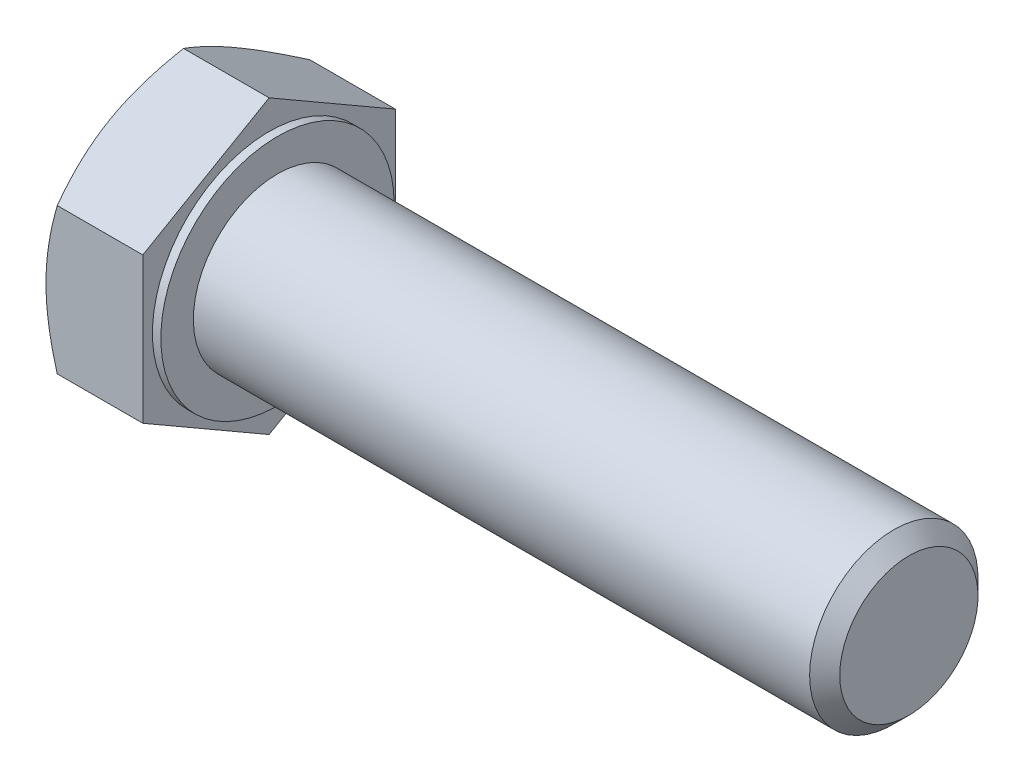
ISO-10303-21;
HEADER;
FILE_DESCRIPTION(('STEP AP214'),'2;1');
FILE_NAME('part.step','',(''),(''),'','','');
FILE_SCHEMA(('AUTOMOTIVE_DESIGN { 1 0 10303 214 1 1 1 1 }'));
ENDSEC;
DATA;
#1=APPLICATION_CONTEXT('core data for automotive mechanical design processes');
#2=APPLICATION_PROTOCOL_DEFINITION('international standard','automotive_design',2000,#1);
#3=PRODUCT_CONTEXT('',#1,'mechanical');
#4=PRODUCT('Part','Part','',(#3));
#5=PRODUCT_RELATED_PRODUCT_CATEGORY('part','',(#4));
#6=PRODUCT_DEFINITION_FORMATION('','',#4);
#7=PRODUCT_DEFINITION_CONTEXT('part definition',#1,'design');
#8=PRODUCT_DEFINITION('design','',#6,#7);
#9=PRODUCT_DEFINITION_SHAPE('','',#8);
#10=(LENGTH_UNIT() NAMED_UNIT(*) SI_UNIT(.MILLI.,.METRE.));
#11=(NAMED_UNIT(*) PLANE_ANGLE_UNIT() SI_UNIT($,.RADIAN.));
#12=(NAMED_UNIT(*) SI_UNIT($,.STERADIAN.) SOLID_ANGLE_UNIT());
#13=UNCERTAINTY_MEASURE_WITH_UNIT(LENGTH_MEASURE(1.E-05),#10,'distance_accuracy_value','');
#14=(GEOMETRIC_REPRESENTATION_CONTEXT(3) GLOBAL_UNCERTAINTY_ASSIGNED_CONTEXT((#13)) GLOBAL_UNIT_ASSIGNED_CONTEXT((#10,
#11,#12)) REPRESENTATION_CONTEXT('',''));
#15=CARTESIAN_POINT('',(0.,0.,0.));
#16=DIRECTION('',(0.,0.,1.));
#17=DIRECTION('',(1.,0.,0.));
#18=AXIS2_PLACEMENT_3D('',#15,#16,#17);
#19=CARTESIAN_POINT('',(45.,3.00000000000001,0.));
#20=DIRECTION('',(1.,0.,0.));
#21=DIRECTION('',(0.,0.,-1.));
#22=AXIS2_PLACEMENT_3D('',#19,#20,#21);
#23=PLANE('',#22);
#24=CARTESIAN_POINT('',(45.0000000071909,0.,0.));
#25=DIRECTION('',(-1.,0.,0.));
#26=DIRECTION('',(0.,0.,1.));
#27=AXIS2_PLACEMENT_3D('',#24,#25,#26);
#28=CIRCLE('',#27,4.92646250719158);
#29=CARTESIAN_POINT('',(45.0000000071909,0.,4.92646250719158));
#30=VERTEX_POINT('',#29);
#31=EDGE_CURVE('E20',#30,#30,#28,.T.);
#32=ORIENTED_EDGE('',*,*,#31,.F.);
#33=EDGE_LOOP('',(#32));
#34=FACE_BOUND('',#33,.T.);
#35=ADVANCED_FACE('F17',(#34),#23,.T.);
#36=CARTESIAN_POINT('',(-7.50009999999999,0.,0.));
#37=DIRECTION('',(-1.,0.,0.));
#38=DIRECTION('',(0.,0.,1.));
#39=AXIS2_PLACEMENT_3D('',#36,#37,#38);
#40=PLANE('',#39);
#41=CARTESIAN_POINT('',(-7.50010001243555,0.,0.));
#42=DIRECTION('',(1.,0.,0.));
#43=DIRECTION('',(0.,0.,-1.));
#44=AXIS2_PLACEMENT_3D('',#41,#42,#43);
#45=CIRCLE('',#44,9.0000000071797);
#46=CARTESIAN_POINT('',(-7.50010001450815,-7.79422863716885,4.50000000179492));
#47=VERTEX_POINT('',#46);
#48=CARTESIAN_POINT('',(-7.50010001450814,-7.79422863716886,-4.50000000179494));
#49=VERTEX_POINT('',#48);
#50=EDGE_CURVE('E93',#47,#49,#45,.T.);
#51=ORIENTED_EDGE('',*,*,#50,.F.);
#52=CARTESIAN_POINT('',(-7.50010001243554,0.,0.));
#53=DIRECTION('',(1.,0.,0.));
#54=DIRECTION('',(0.,0.,-1.));
#55=AXIS2_PLACEMENT_3D('',#52,#53,#54);
#56=CIRCLE('',#55,9.0000000071797);
#57=CARTESIAN_POINT('',(-7.50010001450815,0.,9.00000000358985));
#58=VERTEX_POINT('',#57);
#59=EDGE_CURVE('E89',#58,#47,#56,.T.);
#60=ORIENTED_EDGE('',*,*,#59,.F.);
#61=CARTESIAN_POINT('',(-7.50010001243554,0.,0.));
#62=DIRECTION('',(1.,0.,0.));
#63=DIRECTION('',(0.,0.,-1.));
#64=AXIS2_PLACEMENT_3D('',#61,#62,#63);
#65=CIRCLE('',#64,9.0000000071797);
#66=CARTESIAN_POINT('',(-7.50010001450814,7.79422863716886,4.50000000179494));
#67=VERTEX_POINT('',#66);
#68=EDGE_CURVE('E86',#67,#58,#65,.T.);
#69=ORIENTED_EDGE('',*,*,#68,.F.);
#70=CARTESIAN_POINT('',(-7.50010001243555,0.,0.));
#71=DIRECTION('',(1.,0.,0.));
#72=DIRECTION('',(0.,0.,-1.));
#73=AXIS2_PLACEMENT_3D('',#70,#71,#72);
#74=CIRCLE('',#73,9.0000000071797);
#75=CARTESIAN_POINT('',(-7.50010001450815,7.79422863716885,-4.50000000179492));
#76=VERTEX_POINT('',#75);
#77=EDGE_CURVE('E165',#76,#67,#74,.T.);
#78=ORIENTED_EDGE('',*,*,#77,.F.);
#79=CARTESIAN_POINT('',(-7.50010001243555,0.,0.));
#80=DIRECTION('',(1.,0.,0.));
#81=DIRECTION('',(0.,0.,-1.));
#82=AXIS2_PLACEMENT_3D('',#79,#80,#81);
#83=CIRCLE('',#82,9.0000000071797);
#84=CARTESIAN_POINT('',(-7.50010001450815,0.,-9.00000000358984));
#85=VERTEX_POINT('',#84);
#86=EDGE_CURVE('E456',#85,#76,#83,.T.);
#87=ORIENTED_EDGE('',*,*,#86,.F.);
#88=CARTESIAN_POINT('',(-7.50010001243554,0.,0.));
#89=DIRECTION('',(1.,0.,0.));
#90=DIRECTION('',(0.,0.,-1.));
#91=AXIS2_PLACEMENT_3D('',#88,#89,#90);
#92=CIRCLE('',#91,9.0000000071797);
#93=EDGE_CURVE('E453',#49,#85,#92,.T.);
#94=ORIENTED_EDGE('',*,*,#93,.F.);
#95=EDGE_LOOP('',(#51,#60,#69,#78,#87,#94));
#96=FACE_BOUND('',#95,.T.);
#97=ADVANCED_FACE('F91',(#96),#40,.T.);
#98=CARTESIAN_POINT('',(45.0000000071909,0.,0.));
#99=DIRECTION('',(-1.,0.,0.));
#100=DIRECTION('',(0.,0.,1.));
#101=AXIS2_PLACEMENT_3D('',#98,#99,#100);
#102=CONICAL_SURFACE('',#101,4.92646250719158,0.785351577178396);
#103=CARTESIAN_POINT('',(43.9263625,0.,0.));
#104=DIRECTION('',(1.,0.,0.));
#105=DIRECTION('',(0.,1.,0.));
#106=AXIS2_PLACEMENT_3D('',#103,#104,#105);
#107=CIRCLE('',#106,6.);
#108=CARTESIAN_POINT('',(43.9263625,6.,0.));
#109=VERTEX_POINT('',#108);
#110=EDGE_CURVE('E164',#109,#109,#107,.F.);
#111=ORIENTED_EDGE('',*,*,#110,.F.);
#112=EDGE_LOOP('',(#111));
#113=FACE_BOUND('',#112,.T.);
#114=ORIENTED_EDGE('',*,*,#31,.T.);
#115=EDGE_LOOP('',(#114));
#116=FACE_BOUND('',#115,.T.);
#117=ADVANCED_FACE('F249',(#113,#116),#102,.T.);
#118=CARTESIAN_POINT('',(-7.50010001243556,0.,0.));
#119=DIRECTION('',(1.,0.,0.));
#120=DIRECTION('',(0.,0.,-1.));
#121=AXIS2_PLACEMENT_3D('',#118,#119,#120);
#122=CONICAL_SURFACE('',#121,9.00000000717967,1.04719753333333);
#123=ORIENTED_EDGE('',*,*,#68,.T.);
#124=CARTESIAN_POINT('',(-6.69625240925319,5.19615241882295,9.00000000306425));
#125=CARTESIAN_POINT('',(-6.81838240506194,4.77318782642183,9.00000000107036));
#126=CARTESIAN_POINT('',(-6.93027480435703,4.34683598151208,9.00000000027976));
#127=CARTESIAN_POINT('',(-7.12759503650367,3.49037404218685,8.99999999972165));
#128=CARTESIAN_POINT('',(-7.21315373088933,3.06029382193967,8.99999999994899));
#129=CARTESIAN_POINT('',(-7.31820528155209,2.41111457768678,9.00000000002554));
#130=CARTESIAN_POINT('',(-7.34935413580915,2.193901443881,9.00000000000688));
#131=CARTESIAN_POINT('',(-7.40327345186691,1.75843528837459,8.99999999999313));
#132=CARTESIAN_POINT('',(-7.4260441341874,1.54018229419705,8.99999999999803));
#133=CARTESIAN_POINT('',(-7.462807025849,1.10182912707807,9.00000000000198));
#134=CARTESIAN_POINT('',(-7.47675459291258,0.881725181381577,9.00000000000099));
#135=CARTESIAN_POINT('',(-7.49542039352945,0.44108441678106,8.99999999999901));
#136=CARTESIAN_POINT('',(-7.50013679924242,0.220547520801381,8.99999999999802));
#137=CARTESIAN_POINT('',(-7.50010001658075,2.99145516754869E-10,9.));
#138=B_SPLINE_CURVE_WITH_KNOTS('',3,(#124,#125,#126,#127,#128,#129,#130,#131,#132,#133,#134,
#135,#136,#137),.UNSPECIFIED.,.F.,.F.,(4,2,2,2,2,2,4),(0.,1.32126598561536,2.63585597891325,
3.29401348411379,3.95215366487481,4.61359774681925,5.27517278649075),.UNSPECIFIED.);
#139=CARTESIAN_POINT('',(-6.69625240740134,5.19615242160208,8.99999999808684));
#140=VERTEX_POINT('',#139);
#141=EDGE_CURVE('E112',#140,#58,#138,.T.);
#142=ORIENTED_EDGE('',*,*,#141,.F.);
#143=CARTESIAN_POINT('',(-7.50010001554443,7.79422863250553,4.49999999910256));
#144=CARTESIAN_POINT('',(-7.50013679887546,7.68395487321934,4.69099975522869));
#145=CARTESIAN_POINT('',(-7.49542039343614,7.57368642561111,4.88199030990155));
#146=CARTESIAN_POINT('',(-7.47675459301751,7.35336604356536,5.2635964062384));
#147=CARTESIAN_POINT('',(-7.46280702587908,7.24331407059011,5.45421201465193));
#148=CARTESIAN_POINT('',(-7.42604413416269,7.02413748692393,5.83383699320663));
#149=CARTESIAN_POINT('',(-7.40327345186256,6.91501098985476,6.02284963064916));
#150=CARTESIAN_POINT('',(-7.34935413580532,6.69727791210452,6.39997438385152));
#151=CARTESIAN_POINT('',(-7.31820528152822,6.58867134518502,6.58808647577563));
#152=CARTESIAN_POINT('',(-7.21315373088869,6.26408172300407,7.15029219297503));
#153=CARTESIAN_POINT('',(-7.12759503663,6.04904161284127,7.52275258945137));
#154=CARTESIAN_POINT('',(-6.93027480410838,5.62081064316584,8.26447038632218));
#155=CARTESIAN_POINT('',(-6.81838240430633,5.40763472073798,8.6337019149269));
#156=CARTESIAN_POINT('',(-6.69625240724701,5.1961524246485,8.99999999663664));
#157=B_SPLINE_CURVE_WITH_KNOTS('',3,(#143,#144,#145,#146,#147,#148,#149,#150,#151,#152,#153,
#154,#155,#156),.UNSPECIFIED.,.F.,.F.,(4,2,2,2,2,2,4),(0.,0.66157503981644,1.32301912187116,
1.98115930268459,2.63931680795318,3.95390680140696,5.27517278727339),.UNSPECIFIED.);
#158=EDGE_CURVE('E106',#67,#140,#157,.T.);
#159=ORIENTED_EDGE('',*,*,#158,.F.);
#160=EDGE_LOOP('',(#123,#142,#159));
#161=FACE_BOUND('',#160,.T.);
#162=ADVANCED_FACE('F111',(#161),#122,.T.);
#163=CARTESIAN_POINT('',(-7.50010001243557,0.,0.));
#164=DIRECTION('',(1.,0.,0.));
#165=DIRECTION('',(0.,0.,-1.));
#166=AXIS2_PLACEMENT_3D('',#163,#164,#165);
#167=CONICAL_SURFACE('',#166,9.00000000717966,1.04719753333333);
#168=CARTESIAN_POINT('',(-7.50010001554445,0.,8.99999999820509));
#169=CARTESIAN_POINT('',(-7.50013679887548,-0.220547520564954,8.9999999993555));
#170=CARTESIAN_POINT('',(-7.49542039343615,-0.441084416598651,8.99999999982733));
#171=CARTESIAN_POINT('',(-7.47675459301752,-0.881725181288248,9.00000000017264));
#172=CARTESIAN_POINT('',(-7.4628070258791,-1.10182912701982,9.00000000004624));
#173=CARTESIAN_POINT('',(-7.4260441341627,-1.54018229419241,8.99999999995399));
#174=CARTESIAN_POINT('',(-7.40327345186258,-1.75843528838851,8.99999999998735));
#175=CARTESIAN_POINT('',(-7.34935413580534,-2.19390144393281,9.00000000001265));
#176=CARTESIAN_POINT('',(-7.31820528152824,-2.41111457775788,9.0000000000046));
#177=CARTESIAN_POINT('',(-7.21315373088871,-3.06029382209588,8.99999999999081));
#178=CARTESIAN_POINT('',(-7.12759503663001,-3.49037404242943,8.9999999999954));
#179=CARTESIAN_POINT('',(-6.93027480410839,-4.34683598179628,9.00000000000463));
#180=CARTESIAN_POINT('',(-6.81838240430634,-4.77318782666006,9.00000000000928));
#181=CARTESIAN_POINT('',(-6.69625240724702,-5.19615241882294,9.));
#182=B_SPLINE_CURVE_WITH_KNOTS('',3,(#168,#169,#170,#171,#172,#173,#174,#175,#176,#177,#178,
#179,#180,#181),.UNSPECIFIED.,.F.,.F.,(4,2,2,2,2,2,4),(0.,0.661575039816441,1.32301912187116,
1.98115930268459,2.63931680795319,3.95390680140696,5.2751727872734),.UNSPECIFIED.);
#183=CARTESIAN_POINT('',(-6.69625240740134,-5.19615242160206,8.99999999808683));
#184=VERTEX_POINT('',#183);
#185=EDGE_CURVE('E99',#58,#184,#182,.T.);
#186=ORIENTED_EDGE('',*,*,#185,.F.);
#187=ORIENTED_EDGE('',*,*,#59,.T.);
#188=CARTESIAN_POINT('',(-6.69625240925319,-5.19615242730219,8.99999999816875));
#189=CARTESIAN_POINT('',(-6.81838240506194,-5.40763472177598,8.63370191525111));
#190=CARTESIAN_POINT('',(-6.93027480435704,-5.62081064354618,8.2644703862136));
#191=CARTESIAN_POINT('',(-7.12759503650368,-6.04904161272546,7.52275258910441));
#192=CARTESIAN_POINT('',(-7.21315373088933,-6.26408172304593,7.15029219281882));
#193=CARTESIAN_POINT('',(-7.3182052815521,-6.58867134523867,6.5880864757245));
#194=CARTESIAN_POINT('',(-7.34935413580915,-6.6972779121254,6.39997438380374));
#195=CARTESIAN_POINT('',(-7.40327345186692,-6.91501098986669,6.02284963063997));
#196=CARTESIAN_POINT('',(-7.42604413418741,-7.02413748695971,5.83383699323266));
#197=CARTESIAN_POINT('',(-7.46280702584901,-7.24331407052262,5.45421201468022));
#198=CARTESIAN_POINT('',(-7.47675459291258,-7.35336604337001,5.26359640623338));
#199=CARTESIAN_POINT('',(-7.49542039352946,-7.57368642566855,4.88199031014534));
#200=CARTESIAN_POINT('',(-7.50013679924243,-7.68395487365753,4.69099975575468));
#201=CARTESIAN_POINT('',(-7.50010001658075,-7.79422863391037,4.50000000025906));
#202=B_SPLINE_CURVE_WITH_KNOTS('',3,(#188,#189,#190,#191,#192,#193,#194,#195,#196,#197,#198,
#199,#200,#201),.UNSPECIFIED.,.F.,.F.,(4,2,2,2,2,2,4),(0.,1.32126598561536,2.63585597891324,
3.29401348411379,3.95215366487481,4.61359774681925,5.27517278649075),.UNSPECIFIED.);
#203=EDGE_CURVE('E101',#184,#47,#202,.T.);
#204=ORIENTED_EDGE('',*,*,#203,.F.);
#205=EDGE_LOOP('',(#186,#187,#204));
#206=FACE_BOUND('',#205,.T.);
#207=ADVANCED_FACE('F100',(#206),#167,.T.);
#208=CARTESIAN_POINT('',(-7.50010001243557,0.,0.));
#209=DIRECTION('',(1.,0.,0.));
#210=DIRECTION('',(0.,0.,-1.));
#211=AXIS2_PLACEMENT_3D('',#208,#209,#210);
#212=CONICAL_SURFACE('',#211,9.00000000717966,1.04719753333333);
#213=CARTESIAN_POINT('',(-7.50010001554446,-7.79422863250551,4.49999999910254));
#214=CARTESIAN_POINT('',(-7.50013679887549,-7.90450239378426,4.30900024412682));
#215=CARTESIAN_POINT('',(-7.49542039343616,-8.01477084220973,4.11800968992579));
#216=CARTESIAN_POINT('',(-7.47675459301753,-8.23509122485357,3.73640359393425));
#217=CARTESIAN_POINT('',(-7.46280702587911,-8.34514319760989,3.54578798539431));
#218=CARTESIAN_POINT('',(-7.42604413416271,-8.5643197811163,3.16616300674736));
#219=CARTESIAN_POINT('',(-7.40327345186259,-8.67344627824324,2.97715036933819));
#220=CARTESIAN_POINT('',(-7.34935413580535,-8.8911793560373,2.60002561616114));
#221=CARTESIAN_POINT('',(-7.31820528152825,-8.99978592294287,2.41191352422897));
#222=CARTESIAN_POINT('',(-7.21315373088871,-9.32437554509992,1.84970780701578));
#223=CARTESIAN_POINT('',(-7.12759503663002,-9.53941565527067,1.47724741054401));
#224=CARTESIAN_POINT('',(-6.9302748041084,-9.96764662496209,0.735529613682441));
#225=CARTESIAN_POINT('',(-6.81838240430635,-10.180822547398,0.366298085082375));
#226=CARTESIAN_POINT('',(-6.69625240724703,-10.3923048434714,3.36335147473121E-09));
#227=B_SPLINE_CURVE_WITH_KNOTS('',3,(#213,#214,#215,#216,#217,#218,#219,#220,#221,#222,#223,
#224,#225,#226),.UNSPECIFIED.,.F.,.F.,(4,2,2,2,2,2,4),(0.,0.661575039816443,1.32301912187116,
1.9811593026846,2.6393168079532,3.95390680140698,5.27517278727341),.UNSPECIFIED.);
#228=CARTESIAN_POINT('',(-6.69625240740134,-10.3923048432041,0.));
#229=VERTEX_POINT('',#228);
#230=EDGE_CURVE('E117',#47,#229,#227,.T.);
#231=ORIENTED_EDGE('',*,*,#230,.F.);
#232=ORIENTED_EDGE('',*,*,#50,.T.);
#233=CARTESIAN_POINT('',(-6.69625240925317,-10.3923048461251,-4.89552124357249E-09));
#234=CARTESIAN_POINT('',(-6.81838240506192,-10.1808225481978,-0.366298085819271));
#235=CARTESIAN_POINT('',(-6.93027480435702,-9.96764662505829,-0.735529614066183));
#236=CARTESIAN_POINT('',(-7.12759503650366,-9.53941565491234,-1.47724741061726));
#237=CARTESIAN_POINT('',(-7.21315373088931,-9.32437554498563,-1.84970780713019));
#238=CARTESIAN_POINT('',(-7.31820528155207,-8.99978592292548,-2.41191352430106));
#239=CARTESIAN_POINT('',(-7.34935413580913,-8.89117935600643,-2.60002561620315));
#240=CARTESIAN_POINT('',(-7.40327345186689,-8.67344627824131,-2.97715036935317));
#241=CARTESIAN_POINT('',(-7.42604413418738,-8.56431978115679,-3.16616300676539));
#242=CARTESIAN_POINT('',(-7.46280702584899,-8.34514319760072,-3.54578798532177));
#243=CARTESIAN_POINT('',(-7.47675459291256,-8.23509122475162,-3.73640359376762));
#244=CARTESIAN_POINT('',(-7.49542039352944,-8.01477084244965,-4.11800968985368));
#245=CARTESIAN_POINT('',(-7.50013679924241,-7.90450239445895,-4.30900024424335));
#246=CARTESIAN_POINT('',(-7.50010001658073,-7.79422863420955,-4.49999999974095));
#247=B_SPLINE_CURVE_WITH_KNOTS('',3,(#233,#234,#235,#236,#237,#238,#239,#240,#241,#242,#243,
#244,#245,#246),.UNSPECIFIED.,.F.,.F.,(4,2,2,2,2,2,4),(0.,1.32126598561536,2.63585597891324,
3.29401348411378,3.9521536648748,4.61359774681923,5.27517278649074),.UNSPECIFIED.);
#248=EDGE_CURVE('E219',#229,#49,#247,.T.);
#249=ORIENTED_EDGE('',*,*,#248,.F.);
#250=EDGE_LOOP('',(#231,#232,#249));
#251=FACE_BOUND('',#250,.T.);
#252=ADVANCED_FACE('F227',(#251),#212,.T.);
#253=CARTESIAN_POINT('',(-7.50010001243556,0.,0.));
#254=DIRECTION('',(1.,0.,0.));
#255=DIRECTION('',(0.,0.,-1.));
#256=AXIS2_PLACEMENT_3D('',#253,#254,#255);
#257=CONICAL_SURFACE('',#256,9.00000000717967,1.04719753333333);
#258=CARTESIAN_POINT('',(-7.50010001554443,-7.79422863250553,-4.49999999910256));
#259=CARTESIAN_POINT('',(-7.50013679887546,-7.68395487321934,-4.69099975522868));
#260=CARTESIAN_POINT('',(-7.49542039343614,-7.57368642561111,-4.88199030990155));
#261=CARTESIAN_POINT('',(-7.47675459301751,-7.35336604356536,-5.2635964062384));
#262=CARTESIAN_POINT('',(-7.46280702587909,-7.24331407059011,-5.45421201465193));
#263=CARTESIAN_POINT('',(-7.42604413416269,-7.02413748692393,-5.83383699320663));
#264=CARTESIAN_POINT('',(-7.40327345186257,-6.91501098985476,-6.02284963064916));
#265=CARTESIAN_POINT('',(-7.34935413580533,-6.69727791210452,-6.39997438385151));
#266=CARTESIAN_POINT('',(-7.31820528152823,-6.58867134518502,-6.58808647577563));
#267=CARTESIAN_POINT('',(-7.2131537308887,-6.26408172300407,-7.15029219297502));
#268=CARTESIAN_POINT('',(-7.12759503663,-6.04904161284127,-7.52275258945137));
#269=CARTESIAN_POINT('',(-6.93027480410838,-5.62081064316584,-8.26447038632218));
#270=CARTESIAN_POINT('',(-6.81838240430633,-5.40763472073798,-8.63370191492689));
#271=CARTESIAN_POINT('',(-6.69625240724701,-5.1961524246485,-8.99999999663663));
#272=B_SPLINE_CURVE_WITH_KNOTS('',3,(#258,#259,#260,#261,#262,#263,#264,#265,#266,#267,#268,
#269,#270,#271),.UNSPECIFIED.,.F.,.F.,(4,2,2,2,2,2,4),(0.,0.66157503981644,1.32301912187116,
1.98115930268459,2.63931680795318,3.95390680140696,5.27517278727339),.UNSPECIFIED.);
#273=CARTESIAN_POINT('',(-6.69625240740134,-5.19615242160208,-8.99999999808683));
#274=VERTEX_POINT('',#273);
#275=EDGE_CURVE('E231',#49,#274,#272,.T.);
#276=ORIENTED_EDGE('',*,*,#275,.F.);
#277=ORIENTED_EDGE('',*,*,#93,.T.);
#278=CARTESIAN_POINT('',(-6.69625240925319,-5.19615241882295,-9.00000000306424));
#279=CARTESIAN_POINT('',(-6.81838240506194,-4.77318782642184,-9.00000000107035));
#280=CARTESIAN_POINT('',(-6.93027480435704,-4.34683598151208,-9.00000000027975));
#281=CARTESIAN_POINT('',(-7.12759503650368,-3.49037404218686,-8.99999999972164));
#282=CARTESIAN_POINT('',(-7.21315373088933,-3.06029382193968,-8.99999999994898));
#283=CARTESIAN_POINT('',(-7.3182052815521,-2.41111457768678,-9.00000000002553));
#284=CARTESIAN_POINT('',(-7.34935413580915,-2.19390144388101,-9.00000000000687));
#285=CARTESIAN_POINT('',(-7.40327345186692,-1.7584352883746,-8.99999999999312));
#286=CARTESIAN_POINT('',(-7.4260441341874,-1.54018229419706,-8.99999999999802));
#287=CARTESIAN_POINT('',(-7.46280702584901,-1.10182912707807,-9.00000000000197));
#288=CARTESIAN_POINT('',(-7.47675459291258,-0.881725181381582,-9.00000000000098));
#289=CARTESIAN_POINT('',(-7.49542039352946,-0.441084416781066,-8.999999999999));
#290=CARTESIAN_POINT('',(-7.50013679924243,-0.220547520801387,-8.99999999999801));
#291=CARTESIAN_POINT('',(-7.50010001658075,-2.99151264265217E-10,-8.99999999999999));
#292=B_SPLINE_CURVE_WITH_KNOTS('',3,(#278,#279,#280,#281,#282,#283,#284,#285,#286,#287,#288,
#289,#290,#291),.UNSPECIFIED.,.F.,.F.,(4,2,2,2,2,2,4),(0.,1.32126598561536,2.63585597891324,
3.29401348411379,3.95215366487481,4.61359774681925,5.27517278649075),.UNSPECIFIED.);
#293=EDGE_CURVE('E213',#274,#85,#292,.T.);
#294=ORIENTED_EDGE('',*,*,#293,.F.);
#295=EDGE_LOOP('',(#276,#277,#294));
#296=FACE_BOUND('',#295,.T.);
#297=ADVANCED_FACE('F224',(#296),#257,.T.);
#298=CARTESIAN_POINT('',(-7.50010001243557,0.,0.));
#299=DIRECTION('',(1.,0.,0.));
#300=DIRECTION('',(0.,0.,-1.));
#301=AXIS2_PLACEMENT_3D('',#298,#299,#300);
#302=CONICAL_SURFACE('',#301,9.00000000717966,1.04719753333333);
#303=ORIENTED_EDGE('',*,*,#86,.T.);
#304=CARTESIAN_POINT('',(-6.69625240925319,5.19615242730219,-8.99999999816874));
#305=CARTESIAN_POINT('',(-6.81838240506194,5.40763472177598,-8.63370191525111));
#306=CARTESIAN_POINT('',(-6.93027480435704,5.62081064354618,-8.2644703862136));
#307=CARTESIAN_POINT('',(-7.12759503650368,6.04904161272546,-7.52275258910441));
#308=CARTESIAN_POINT('',(-7.21315373088933,6.26408172304593,-7.15029219281882));
#309=CARTESIAN_POINT('',(-7.3182052815521,6.58867134523867,-6.5880864757245));
#310=CARTESIAN_POINT('',(-7.34935413580915,6.6972779121254,-6.39997438380374));
#311=CARTESIAN_POINT('',(-7.40327345186692,6.91501098986669,-6.02284963063997));
#312=CARTESIAN_POINT('',(-7.4260441341874,7.02413748695971,-5.83383699323266));
#313=CARTESIAN_POINT('',(-7.46280702584901,7.24331407052262,-5.45421201468023));
#314=CARTESIAN_POINT('',(-7.47675459291258,7.35336604337001,-5.26359640623338));
#315=CARTESIAN_POINT('',(-7.49542039352946,7.57368642566855,-4.88199031014534));
#316=CARTESIAN_POINT('',(-7.50013679924243,7.68395487365754,-4.69099975575468));
#317=CARTESIAN_POINT('',(-7.50010001658075,7.79422863391037,-4.50000000025907));
#318=B_SPLINE_CURVE_WITH_KNOTS('',3,(#304,#305,#306,#307,#308,#309,#310,#311,#312,#313,#314,
#315,#316,#317),.UNSPECIFIED.,.F.,.F.,(4,2,2,2,2,2,4),(0.,1.32126598561536,2.63585597891324,
3.29401348411379,3.95215366487481,4.61359774681924,5.27517278649075),.UNSPECIFIED.);
#319=CARTESIAN_POINT('',(-6.69625240740135,5.19615242160206,-8.99999999808683));
#320=VERTEX_POINT('',#319);
#321=EDGE_CURVE('E186',#320,#76,#318,.T.);
#322=ORIENTED_EDGE('',*,*,#321,.F.);
#323=CARTESIAN_POINT('',(-7.50010001554446,0.,-8.99999999820508));
#324=CARTESIAN_POINT('',(-7.50013679887549,0.220547520564948,-8.99999999935549));
#325=CARTESIAN_POINT('',(-7.49542039343616,0.441084416598646,-8.99999999982732));
#326=CARTESIAN_POINT('',(-7.47675459301753,0.881725181288243,-9.00000000017263));
#327=CARTESIAN_POINT('',(-7.4628070258791,1.10182912701982,-9.00000000004623));
#328=CARTESIAN_POINT('',(-7.42604413416271,1.5401822941924,-8.99999999995399));
#329=CARTESIAN_POINT('',(-7.40327345186259,1.75843528838851,-8.99999999998734));
#330=CARTESIAN_POINT('',(-7.34935413580534,2.19390144393281,-9.00000000001265));
#331=CARTESIAN_POINT('',(-7.31820528152825,2.41111457775788,-9.00000000000459));
#332=CARTESIAN_POINT('',(-7.21315373088871,3.06029382209588,-8.9999999999908));
#333=CARTESIAN_POINT('',(-7.12759503663001,3.49037404242942,-8.99999999999539));
#334=CARTESIAN_POINT('',(-6.9302748041084,4.34683598179628,-9.00000000000462));
#335=CARTESIAN_POINT('',(-6.81838240430635,4.77318782666006,-9.00000000000927));
#336=CARTESIAN_POINT('',(-6.69625240724703,5.19615241882294,-8.99999999999999));
#337=B_SPLINE_CURVE_WITH_KNOTS('',3,(#323,#324,#325,#326,#327,#328,#329,#330,#331,#332,#333,
#334,#335,#336),.UNSPECIFIED.,.F.,.F.,(4,2,2,2,2,2,4),(0.,0.661575039816441,1.32301912187116,
1.98115930268459,2.63931680795319,3.95390680140696,5.2751727872734),.UNSPECIFIED.);
#338=EDGE_CURVE('E208',#85,#320,#337,.T.);
#339=ORIENTED_EDGE('',*,*,#338,.F.);
#340=EDGE_LOOP('',(#303,#322,#339));
#341=FACE_BOUND('',#340,.T.);
#342=ADVANCED_FACE('F171',(#341),#302,.T.);
#343=CARTESIAN_POINT('',(-7.50010001243557,0.,0.));
#344=DIRECTION('',(1.,0.,0.));
#345=DIRECTION('',(0.,0.,-1.));
#346=AXIS2_PLACEMENT_3D('',#343,#344,#345);
#347=CONICAL_SURFACE('',#346,9.00000000717966,1.04719753333333);
#348=ORIENTED_EDGE('',*,*,#77,.T.);
#349=CARTESIAN_POINT('',(-6.69625240925317,10.3923048461251,4.89552759615805E-09));
#350=CARTESIAN_POINT('',(-6.81838240506192,10.1808225481978,0.366298085819277));
#351=CARTESIAN_POINT('',(-6.93027480435702,9.96764662505829,0.73552961406619));
#352=CARTESIAN_POINT('',(-7.12759503650366,9.53941565491234,1.47724741061727));
#353=CARTESIAN_POINT('',(-7.21315373088931,9.32437554498563,1.8497078071302));
#354=CARTESIAN_POINT('',(-7.31820528155207,8.99978592292548,2.41191352430106));
#355=CARTESIAN_POINT('',(-7.34935413580913,8.89117935600643,2.60002561620316));
#356=CARTESIAN_POINT('',(-7.40327345186689,8.67344627824131,2.97715036935317));
#357=CARTESIAN_POINT('',(-7.42604413418738,8.56431978115679,3.16616300676539));
#358=CARTESIAN_POINT('',(-7.46280702584899,8.34514319760072,3.54578798532177));
#359=CARTESIAN_POINT('',(-7.47675459291256,8.23509122475162,3.73640359376763));
#360=CARTESIAN_POINT('',(-7.49542039352944,8.01477084244965,4.11800968985368));
#361=CARTESIAN_POINT('',(-7.50013679924241,7.90450239445895,4.30900024424335));
#362=CARTESIAN_POINT('',(-7.50010001658073,7.79422863420955,4.49999999974095));
#363=B_SPLINE_CURVE_WITH_KNOTS('',3,(#349,#350,#351,#352,#353,#354,#355,#356,#357,#358,#359,
#360,#361,#362),.UNSPECIFIED.,.F.,.F.,(4,2,2,2,2,2,4),(0.,1.32126598561536,2.63585597891323,
3.29401348411377,3.95215366487479,4.61359774681923,5.27517278649073),.UNSPECIFIED.);
#364=CARTESIAN_POINT('',(-6.69625240676361,10.3923048443087,1.91319895317567E-09));
#365=VERTEX_POINT('',#364);
#366=EDGE_CURVE('E159',#365,#67,#363,.T.);
#367=ORIENTED_EDGE('',*,*,#366,.F.);
#368=CARTESIAN_POINT('',(-7.50010001554446,7.79422863250551,-4.49999999910254));
#369=CARTESIAN_POINT('',(-7.50013679887549,7.90450239378426,-4.30900024412683));
#370=CARTESIAN_POINT('',(-7.49542039343616,8.01477084220973,-4.11800968992579));
#371=CARTESIAN_POINT('',(-7.47675459301753,8.23509122485358,-3.73640359393425));
#372=CARTESIAN_POINT('',(-7.4628070258791,8.3451431976099,-3.54578798539431));
#373=CARTESIAN_POINT('',(-7.42604413416271,8.56431978111631,-3.16616300674737));
#374=CARTESIAN_POINT('',(-7.40327345186259,8.67344627824324,-2.9771503693382));
#375=CARTESIAN_POINT('',(-7.34935413580534,8.89117935603731,-2.60002561616114));
#376=CARTESIAN_POINT('',(-7.31820528152825,8.99978592294287,-2.41191352422897));
#377=CARTESIAN_POINT('',(-7.21315373088871,9.32437554509993,-1.84970780701578));
#378=CARTESIAN_POINT('',(-7.12759503663001,9.53941565527067,-1.47724741054401));
#379=CARTESIAN_POINT('',(-6.93027480410839,9.9676466249621,-0.735529613682443));
#380=CARTESIAN_POINT('',(-6.81838240430634,10.180822547398,-0.366298085082378));
#381=CARTESIAN_POINT('',(-6.69625240724702,10.3923048434714,-3.36335352181223E-09));
#382=B_SPLINE_CURVE_WITH_KNOTS('',3,(#368,#369,#370,#371,#372,#373,#374,#375,#376,#377,#378,
#379,#380,#381),.UNSPECIFIED.,.F.,.F.,(4,2,2,2,2,2,4),(0.,0.661575039816443,1.32301912187117,
1.9811593026846,2.6393168079532,3.95390680140698,5.27517278727342),.UNSPECIFIED.);
#383=EDGE_CURVE('E177',#76,#365,#382,.T.);
#384=ORIENTED_EDGE('',*,*,#383,.F.);
#385=EDGE_LOOP('',(#348,#367,#384));
#386=FACE_BOUND('',#385,.T.);
#387=ADVANCED_FACE('F167',(#386),#347,.T.);
#388=CARTESIAN_POINT('',(0.,0.,0.));
#389=DIRECTION('',(1.,0.,0.));
#390=DIRECTION('',(0.,1.,0.));
#391=AXIS2_PLACEMENT_3D('',#388,#389,#390);
#392=CYLINDRICAL_SURFACE('',#391,6.);
#393=ORIENTED_EDGE('',*,*,#110,.T.);
#394=EDGE_LOOP('',(#393));
#395=FACE_BOUND('',#394,.T.);
#396=CARTESIAN_POINT('',(0.,0.,0.));
#397=DIRECTION('',(1.,0.,0.));
#398=DIRECTION('',(0.,1.,0.));
#399=AXIS2_PLACEMENT_3D('',#396,#397,#398);
#400=CIRCLE('',#399,6.);
#401=CARTESIAN_POINT('',(0.,6.,0.));
#402=VERTEX_POINT('',#401);
#403=EDGE_CURVE('E187',#402,#402,#400,.F.);
#404=ORIENTED_EDGE('',*,*,#403,.F.);
#405=EDGE_LOOP('',(#404));
#406=FACE_BOUND('',#405,.T.);
#407=ADVANCED_FACE('F151',(#395,#406),#392,.T.);
#408=CARTESIAN_POINT('',(-0.600099999999995,10.3923048454133,0.));
#409=DIRECTION('',(0.,0.866025403784438,0.500000000000001));
#410=DIRECTION('',(0.,-0.500000000000001,0.866025403784438));
#411=AXIS2_PLACEMENT_3D('',#408,#409,#410);
#412=PLANE('',#411);
#413=DIRECTION('',(0.,-0.500000000000004,0.866025403784436));
#414=VECTOR('',#413,1.);
#415=CARTESIAN_POINT('',(-0.600099999999994,10.3923048454133,0.));
#416=LINE('',#415,#414);
#417=CARTESIAN_POINT('',(-0.600099999999995,10.3923048454133,0.));
#418=VERTEX_POINT('',#417);
#419=CARTESIAN_POINT('',(-0.600099999999994,5.19615242270662,9.));
#420=VERTEX_POINT('',#419);
#421=EDGE_CURVE('E277',#418,#420,#416,.T.);
#422=ORIENTED_EDGE('',*,*,#421,.F.);
#423=DIRECTION('',(1.,0.,0.));
#424=VECTOR('',#423,1.);
#425=CARTESIAN_POINT('',(-0.600099999999995,10.3923048454133,0.));
#426=LINE('',#425,#424);
#427=EDGE_CURVE('E185',#365,#418,#426,.T.);
#428=ORIENTED_EDGE('',*,*,#427,.F.);
#429=ORIENTED_EDGE('',*,*,#366,.T.);
#430=ORIENTED_EDGE('',*,*,#158,.T.);
#431=DIRECTION('',(1.,0.,0.));
#432=VECTOR('',#431,1.);
#433=CARTESIAN_POINT('',(-0.600099999999995,5.19615242270662,9.));
#434=LINE('',#433,#432);
#435=EDGE_CURVE('E105',#420,#140,#434,.F.);
#436=ORIENTED_EDGE('',*,*,#435,.F.);
#437=EDGE_LOOP('',(#422,#428,#429,#430,#436));
#438=FACE_BOUND('',#437,.T.);
#439=ADVANCED_FACE('F144',(#438),#412,.T.);
#440=CARTESIAN_POINT('',(-0.600099999999995,5.19615242270662,9.));
#441=DIRECTION('',(0.,0.,1.));
#442=DIRECTION('',(1.,0.,0.));
#443=AXIS2_PLACEMENT_3D('',#440,#441,#442);
#444=PLANE('',#443);
#445=ORIENTED_EDGE('',*,*,#435,.T.);
#446=ORIENTED_EDGE('',*,*,#141,.T.);
#447=ORIENTED_EDGE('',*,*,#185,.T.);
#448=DIRECTION('',(1.,0.,0.));
#449=VECTOR('',#448,1.);
#450=CARTESIAN_POINT('',(-0.600099999999993,-5.19615242270663,8.99999999999999));
#451=LINE('',#450,#449);
#452=CARTESIAN_POINT('',(-0.600099999999994,-5.19615242270663,8.99999999999999));
#453=VERTEX_POINT('',#452);
#454=EDGE_CURVE('E119',#453,#184,#451,.F.);
#455=ORIENTED_EDGE('',*,*,#454,.F.);
#456=DIRECTION('',(0.,1.,0.));
#457=VECTOR('',#456,1.);
#458=CARTESIAN_POINT('',(-0.600099999999994,0.,9.));
#459=LINE('',#458,#457);
#460=EDGE_CURVE('E273',#420,#453,#459,.F.);
#461=ORIENTED_EDGE('',*,*,#460,.F.);
#462=EDGE_LOOP('',(#445,#446,#447,#455,#461));
#463=FACE_BOUND('',#462,.T.);
#464=ADVANCED_FACE('F115',(#463),#444,.T.);
#465=CARTESIAN_POINT('',(-0.600099999999993,-5.19615242270663,8.99999999999999));
#466=DIRECTION('',(0.,-0.866025403784439,0.499999999999999));
#467=DIRECTION('',(0.,-0.499999999999999,-0.866025403784439));
#468=AXIS2_PLACEMENT_3D('',#465,#466,#467);
#469=PLANE('',#468);
#470=ORIENTED_EDGE('',*,*,#454,.T.);
#471=ORIENTED_EDGE('',*,*,#203,.T.);
#472=ORIENTED_EDGE('',*,*,#230,.T.);
#473=DIRECTION('',(1.,0.,0.));
#474=VECTOR('',#473,1.);
#475=CARTESIAN_POINT('',(-0.600099999999993,-10.3923048454133,0.));
#476=LINE('',#475,#474);
#477=CARTESIAN_POINT('',(-0.600099999999994,-10.3923048454133,0.));
#478=VERTEX_POINT('',#477);
#479=EDGE_CURVE('E236',#478,#229,#476,.F.);
#480=ORIENTED_EDGE('',*,*,#479,.F.);
#481=DIRECTION('',(0.,-0.500000000000003,-0.866025403784437));
#482=VECTOR('',#481,1.);
#483=CARTESIAN_POINT('',(-0.600099999999994,-5.19615242270663,8.99999999999999));
#484=LINE('',#483,#482);
#485=EDGE_CURVE('E276',#453,#478,#484,.T.);
#486=ORIENTED_EDGE('',*,*,#485,.F.);
#487=EDGE_LOOP('',(#470,#471,#472,#480,#486));
#488=FACE_BOUND('',#487,.T.);
#489=ADVANCED_FACE('F143',(#488),#469,.T.);
#490=CARTESIAN_POINT('',(-0.600099999999993,-10.3923048454133,0.));
#491=DIRECTION('',(0.,-0.866025403784438,-0.500000000000001));
#492=DIRECTION('',(0.,0.500000000000001,-0.866025403784438));
#493=AXIS2_PLACEMENT_3D('',#490,#491,#492);
#494=PLANE('',#493);
#495=ORIENTED_EDGE('',*,*,#479,.T.);
#496=ORIENTED_EDGE('',*,*,#248,.T.);
#497=ORIENTED_EDGE('',*,*,#275,.T.);
#498=DIRECTION('',(-1.,0.,0.));
#499=VECTOR('',#498,1.);
#500=CARTESIAN_POINT('',(-0.600099999999993,-5.19615242270662,-8.99999999999999));
#501=LINE('',#500,#499);
#502=CARTESIAN_POINT('',(-0.600099999999995,-5.19615242270663,-8.99999999999999));
#503=VERTEX_POINT('',#502);
#504=EDGE_CURVE('E308',#503,#274,#501,.T.);
#505=ORIENTED_EDGE('',*,*,#504,.F.);
#506=DIRECTION('',(0.,0.500000000000004,-0.866025403784436));
#507=VECTOR('',#506,1.);
#508=CARTESIAN_POINT('',(-0.600099999999994,-10.3923048454133,0.));
#509=LINE('',#508,#507);
#510=EDGE_CURVE('E282',#478,#503,#509,.T.);
#511=ORIENTED_EDGE('',*,*,#510,.F.);
#512=EDGE_LOOP('',(#495,#496,#497,#505,#511));
#513=FACE_BOUND('',#512,.T.);
#514=ADVANCED_FACE('F205',(#513),#494,.T.);
#515=CARTESIAN_POINT('',(-0.600099999999993,-5.19615242270662,-8.99999999999999));
#516=DIRECTION('',(0.,0.,-1.));
#517=DIRECTION('',(-1.,0.,0.));
#518=AXIS2_PLACEMENT_3D('',#515,#516,#517);
#519=PLANE('',#518);
#520=DIRECTION('',(0.,1.,0.));
#521=VECTOR('',#520,1.);
#522=CARTESIAN_POINT('',(-0.600099999999994,0.,-8.99999999999999));
#523=LINE('',#522,#521);
#524=CARTESIAN_POINT('',(-0.600099999999995,5.19615242270663,-8.99999999999999));
#525=VERTEX_POINT('',#524);
#526=EDGE_CURVE('E266',#503,#525,#523,.T.);
#527=ORIENTED_EDGE('',*,*,#526,.F.);
#528=ORIENTED_EDGE('',*,*,#504,.T.);
#529=ORIENTED_EDGE('',*,*,#293,.T.);
#530=ORIENTED_EDGE('',*,*,#338,.T.);
#531=DIRECTION('',(1.,0.,0.));
#532=VECTOR('',#531,1.);
#533=CARTESIAN_POINT('',(-0.600099999999995,5.19615242270663,-8.99999999999999));
#534=LINE('',#533,#532);
#535=EDGE_CURVE('E35',#525,#320,#534,.F.);
#536=ORIENTED_EDGE('',*,*,#535,.F.);
#537=EDGE_LOOP('',(#527,#528,#529,#530,#536));
#538=FACE_BOUND('',#537,.T.);
#539=ADVANCED_FACE('F199',(#538),#519,.T.);
#540=CARTESIAN_POINT('',(-0.600099999999995,5.19615242270663,-8.99999999999999));
#541=DIRECTION('',(0.,0.866025403784439,-0.5));
#542=DIRECTION('',(0.,0.5,0.866025403784439));
#543=AXIS2_PLACEMENT_3D('',#540,#541,#542);
#544=PLANE('',#543);
#545=DIRECTION('',(0.,0.500000000000003,0.866025403784437));
#546=VECTOR('',#545,1.);
#547=CARTESIAN_POINT('',(-0.600099999999994,5.19615242270663,-8.99999999999999));
#548=LINE('',#547,#546);
#549=EDGE_CURVE('E264',#525,#418,#548,.T.);
#550=ORIENTED_EDGE('',*,*,#549,.F.);
#551=ORIENTED_EDGE('',*,*,#535,.T.);
#552=ORIENTED_EDGE('',*,*,#321,.T.);
#553=ORIENTED_EDGE('',*,*,#383,.T.);
#554=ORIENTED_EDGE('',*,*,#427,.T.);
#555=EDGE_LOOP('',(#550,#551,#552,#553,#554));
#556=FACE_BOUND('',#555,.T.);
#557=ADVANCED_FACE('F193',(#556),#544,.T.);
#558=CARTESIAN_POINT('',(0.,7.1575,0.));
#559=DIRECTION('',(1.,0.,0.));
#560=DIRECTION('',(0.,0.,-1.));
#561=AXIS2_PLACEMENT_3D('',#558,#559,#560);
#562=PLANE('',#561);
#563=ORIENTED_EDGE('',*,*,#403,.T.);
#564=EDGE_LOOP('',(#563));
#565=FACE_BOUND('',#564,.T.);
#566=CARTESIAN_POINT('',(0.,0.,0.));
#567=DIRECTION('',(1.,0.,0.));
#568=DIRECTION('',(0.,0.,-1.));
#569=AXIS2_PLACEMENT_3D('',#566,#567,#568);
#570=CIRCLE('',#569,8.315);
#571=CARTESIAN_POINT('',(0.,0.,-8.315));
#572=VERTEX_POINT('',#571);
#573=EDGE_CURVE('E26',#572,#572,#570,.F.);
#574=ORIENTED_EDGE('',*,*,#573,.F.);
#575=EDGE_LOOP('',(#574));
#576=FACE_BOUND('',#575,.T.);
#577=ADVANCED_FACE('F198',(#565,#576),#562,.T.);
#578=CARTESIAN_POINT('',(-0.600099999999994,0.,0.));
#579=DIRECTION('',(1.,0.,0.));
#580=DIRECTION('',(0.,0.,-1.));
#581=AXIS2_PLACEMENT_3D('',#578,#579,#580);
#582=PLANE('',#581);
#583=CARTESIAN_POINT('',(-0.600099999999991,0.,0.));
#584=DIRECTION('',(1.,0.,0.));
#585=DIRECTION('',(0.,0.,-1.));
#586=AXIS2_PLACEMENT_3D('',#583,#584,#585);
#587=CIRCLE('',#586,8.315);
#588=CARTESIAN_POINT('',(-0.600099999999991,0.,-8.315));
#589=VERTEX_POINT('',#588);
#590=EDGE_CURVE('E11',#589,#589,#587,.T.);
#591=ORIENTED_EDGE('',*,*,#590,.F.);
#592=EDGE_LOOP('',(#591));
#593=FACE_BOUND('',#592,.T.);
#594=ORIENTED_EDGE('',*,*,#526,.T.);
#595=ORIENTED_EDGE('',*,*,#549,.T.);
#596=ORIENTED_EDGE('',*,*,#421,.T.);
#597=ORIENTED_EDGE('',*,*,#460,.T.);
#598=ORIENTED_EDGE('',*,*,#485,.T.);
#599=ORIENTED_EDGE('',*,*,#510,.T.);
#600=EDGE_LOOP('',(#594,#595,#596,#597,#598,#599));
#601=FACE_BOUND('',#600,.T.);
#602=ADVANCED_FACE('F252',(#593,#601),#582,.T.);
#603=CARTESIAN_POINT('',(-0.600099999999993,0.,0.));
#604=DIRECTION('',(1.,0.,0.));
#605=DIRECTION('',(0.,0.,-1.));
#606=AXIS2_PLACEMENT_3D('',#603,#604,#605);
#607=CYLINDRICAL_SURFACE('',#606,8.315);
#608=ORIENTED_EDGE('',*,*,#590,.T.);
#609=EDGE_LOOP('',(#608));
#610=FACE_BOUND('',#609,.T.);
#611=ORIENTED_EDGE('',*,*,#573,.T.);
#612=EDGE_LOOP('',(#611));
#613=FACE_BOUND('',#612,.T.);
#614=ADVANCED_FACE('F250',(#610,#613),#607,.T.);
#615=CLOSED_SHELL('',(#35,#97,#117,#162,#207,#252,#297,#342,#387,#407,#439,#464,#489,#514,#539,
#557,#577,#602,#614));
#616=MANIFOLD_SOLID_BREP('B1',#615);
#617=ADVANCED_BREP_SHAPE_REPRESENTATION('',(#18,#616),#14);
#618=SHAPE_DEFINITION_REPRESENTATION(#9,#617);
ENDSEC;
END-ISO-10303-21;
